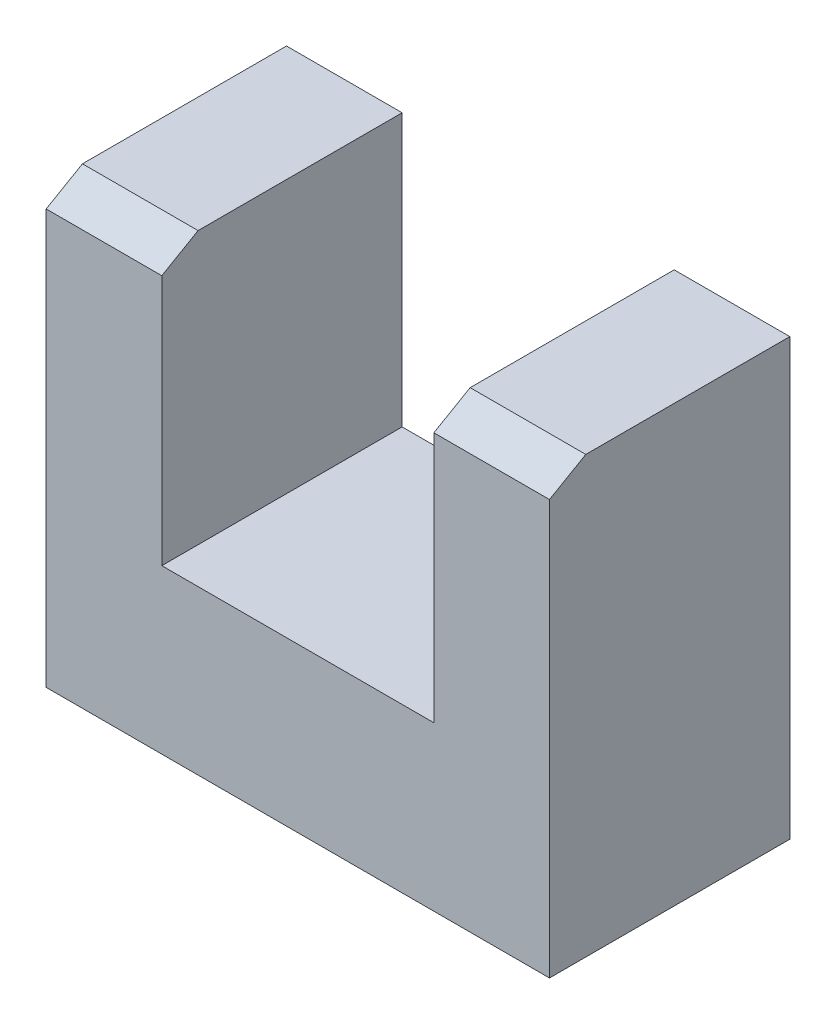
ISO-10303-21;
HEADER;
FILE_DESCRIPTION(('STEP AP214'),'2;1');
FILE_NAME('part.step','',(''),(''),'','','');
FILE_SCHEMA(('AUTOMOTIVE_DESIGN { 1 0 10303 214 1 1 1 1 }'));
ENDSEC;
DATA;
#1=APPLICATION_CONTEXT('core data for automotive mechanical design processes');
#2=APPLICATION_PROTOCOL_DEFINITION('international standard','automotive_design',2000,#1);
#3=PRODUCT_CONTEXT('',#1,'mechanical');
#4=PRODUCT('Part','Part','',(#3));
#5=PRODUCT_RELATED_PRODUCT_CATEGORY('part','',(#4));
#6=PRODUCT_DEFINITION_FORMATION('','',#4);
#7=PRODUCT_DEFINITION_CONTEXT('part definition',#1,'design');
#8=PRODUCT_DEFINITION('design','',#6,#7);
#9=PRODUCT_DEFINITION_SHAPE('','',#8);
#10=(LENGTH_UNIT() NAMED_UNIT(*) SI_UNIT(.MILLI.,.METRE.));
#11=(NAMED_UNIT(*) PLANE_ANGLE_UNIT() SI_UNIT($,.RADIAN.));
#12=(NAMED_UNIT(*) SI_UNIT($,.STERADIAN.) SOLID_ANGLE_UNIT());
#13=UNCERTAINTY_MEASURE_WITH_UNIT(LENGTH_MEASURE(1.E-05),#10,'distance_accuracy_value','');
#14=(GEOMETRIC_REPRESENTATION_CONTEXT(3) GLOBAL_UNCERTAINTY_ASSIGNED_CONTEXT((#13)) GLOBAL_UNIT_ASSIGNED_CONTEXT((#10,
#11,#12)) REPRESENTATION_CONTEXT('',''));
#15=CARTESIAN_POINT('',(0.,0.,0.));
#16=DIRECTION('',(0.,0.,1.));
#17=DIRECTION('',(1.,0.,0.));
#18=AXIS2_PLACEMENT_3D('',#15,#16,#17);
#19=CARTESIAN_POINT('',(1.5,0.,2.65));
#20=DIRECTION('',(1.,0.,0.));
#21=DIRECTION('',(0.,1.,0.));
#22=AXIS2_PLACEMENT_3D('',#19,#20,#21);
#23=PLANE('',#22);
#24=DIRECTION('',(0.,-1.,0.));
#25=VECTOR('',#24,1.);
#26=CARTESIAN_POINT('',(1.5,0.,2.65));
#27=LINE('',#26,#25);
#28=CARTESIAN_POINT('',(1.5,2.76905989232415,2.65));
#29=VERTEX_POINT('',#28);
#30=CARTESIAN_POINT('',(1.5,0.,2.65));
#31=VERTEX_POINT('',#30);
#32=EDGE_CURVE('E108',#29,#31,#27,.T.);
#33=ORIENTED_EDGE('',*,*,#32,.F.);
#34=DIRECTION('',(0.,-0.499999999999999,0.866025403784439));
#35=VECTOR('',#34,1.);
#36=CARTESIAN_POINT('',(1.5,2.76905989232415,2.65));
#37=LINE('',#36,#35);
#38=CARTESIAN_POINT('',(1.5,3.,2.25));
#39=VERTEX_POINT('',#38);
#40=EDGE_CURVE('E142',#29,#39,#37,.F.);
#41=ORIENTED_EDGE('',*,*,#40,.T.);
#42=DIRECTION('',(0.,0.,-1.));
#43=VECTOR('',#42,1.);
#44=CARTESIAN_POINT('',(1.5,3.,2.65));
#45=LINE('',#44,#43);
#46=CARTESIAN_POINT('',(1.5,3.,0.));
#47=VERTEX_POINT('',#46);
#48=EDGE_CURVE('E162',#39,#47,#45,.T.);
#49=ORIENTED_EDGE('',*,*,#48,.T.);
#50=DIRECTION('',(0.,-1.,0.));
#51=VECTOR('',#50,1.);
#52=CARTESIAN_POINT('',(1.5,0.,0.));
#53=LINE('',#52,#51);
#54=CARTESIAN_POINT('',(1.5,0.,0.));
#55=VERTEX_POINT('',#54);
#56=EDGE_CURVE('E132',#47,#55,#53,.T.);
#57=ORIENTED_EDGE('',*,*,#56,.T.);
#58=DIRECTION('',(0.,0.,-1.));
#59=VECTOR('',#58,1.);
#60=CARTESIAN_POINT('',(1.5,0.,2.65));
#61=LINE('',#60,#59);
#62=EDGE_CURVE('E124',#31,#55,#61,.T.);
#63=ORIENTED_EDGE('',*,*,#62,.F.);
#64=EDGE_LOOP('',(#33,#41,#49,#57,#63));
#65=FACE_BOUND('',#64,.T.);
#66=ADVANCED_FACE('F33',(#65),#23,.F.);
#67=CARTESIAN_POINT('',(-1.5,0.,2.65));
#68=DIRECTION('',(0.,-1.,0.));
#69=DIRECTION('',(1.,0.,0.));
#70=AXIS2_PLACEMENT_3D('',#67,#68,#69);
#71=PLANE('',#70);
#72=DIRECTION('',(-1.,0.,0.));
#73=VECTOR('',#72,1.);
#74=CARTESIAN_POINT('',(-1.5,0.,0.));
#75=LINE('',#74,#73);
#76=CARTESIAN_POINT('',(-1.5,0.,0.));
#77=VERTEX_POINT('',#76);
#78=EDGE_CURVE('E193',#55,#77,#75,.T.);
#79=ORIENTED_EDGE('',*,*,#78,.T.);
#80=DIRECTION('',(0.,0.,-1.));
#81=VECTOR('',#80,1.);
#82=CARTESIAN_POINT('',(-1.5,0.,2.65));
#83=LINE('',#82,#81);
#84=CARTESIAN_POINT('',(-1.5,0.,2.65));
#85=VERTEX_POINT('',#84);
#86=EDGE_CURVE('E127',#85,#77,#83,.T.);
#87=ORIENTED_EDGE('',*,*,#86,.F.);
#88=DIRECTION('',(-1.,0.,0.));
#89=VECTOR('',#88,1.);
#90=CARTESIAN_POINT('',(-1.5,0.,2.65));
#91=LINE('',#90,#89);
#92=EDGE_CURVE('E113',#31,#85,#91,.T.);
#93=ORIENTED_EDGE('',*,*,#92,.F.);
#94=ORIENTED_EDGE('',*,*,#62,.T.);
#95=EDGE_LOOP('',(#79,#87,#93,#94));
#96=FACE_BOUND('',#95,.T.);
#97=ADVANCED_FACE('F123',(#96),#71,.F.);
#98=CARTESIAN_POINT('',(-1.5,0.,2.65));
#99=DIRECTION('',(-1.,0.,0.));
#100=DIRECTION('',(0.,-1.,0.));
#101=AXIS2_PLACEMENT_3D('',#98,#99,#100);
#102=PLANE('',#101);
#103=DIRECTION('',(0.,0.,-1.));
#104=VECTOR('',#103,1.);
#105=CARTESIAN_POINT('',(-1.5,3.,2.65));
#106=LINE('',#105,#104);
#107=CARTESIAN_POINT('',(-1.5,3.,2.25));
#108=VERTEX_POINT('',#107);
#109=CARTESIAN_POINT('',(-1.5,3.,0.));
#110=VERTEX_POINT('',#109);
#111=EDGE_CURVE('E137',#108,#110,#106,.T.);
#112=ORIENTED_EDGE('',*,*,#111,.F.);
#113=DIRECTION('',(0.,0.5,-0.866025403784439));
#114=VECTOR('',#113,1.);
#115=CARTESIAN_POINT('',(-1.5,2.76905989232415,2.65));
#116=LINE('',#115,#114);
#117=CARTESIAN_POINT('',(-1.5,2.76905989232415,2.65));
#118=VERTEX_POINT('',#117);
#119=EDGE_CURVE('E11',#108,#118,#116,.F.);
#120=ORIENTED_EDGE('',*,*,#119,.T.);
#121=DIRECTION('',(0.,1.,0.));
#122=VECTOR('',#121,1.);
#123=CARTESIAN_POINT('',(-1.5,0.,2.65));
#124=LINE('',#123,#122);
#125=EDGE_CURVE('E129',#85,#118,#124,.T.);
#126=ORIENTED_EDGE('',*,*,#125,.F.);
#127=ORIENTED_EDGE('',*,*,#86,.T.);
#128=DIRECTION('',(0.,1.,0.));
#129=VECTOR('',#128,1.);
#130=CARTESIAN_POINT('',(-1.5,0.,0.));
#131=LINE('',#130,#129);
#132=EDGE_CURVE('E190',#77,#110,#131,.T.);
#133=ORIENTED_EDGE('',*,*,#132,.T.);
#134=EDGE_LOOP('',(#112,#120,#126,#127,#133));
#135=FACE_BOUND('',#134,.T.);
#136=ADVANCED_FACE('F191',(#135),#102,.F.);
#137=CARTESIAN_POINT('',(-1.5,3.,2.65));
#138=DIRECTION('',(0.,-1.,0.));
#139=DIRECTION('',(1.,0.,0.));
#140=AXIS2_PLACEMENT_3D('',#137,#138,#139);
#141=PLANE('',#140);
#142=DIRECTION('',(0.,0.,-1.));
#143=VECTOR('',#142,1.);
#144=CARTESIAN_POINT('',(-2.775,3.,2.65));
#145=LINE('',#144,#143);
#146=CARTESIAN_POINT('',(-2.775,3.,2.25));
#147=VERTEX_POINT('',#146);
#148=CARTESIAN_POINT('',(-2.775,3.,0.));
#149=VERTEX_POINT('',#148);
#150=EDGE_CURVE('E180',#147,#149,#145,.T.);
#151=ORIENTED_EDGE('',*,*,#150,.F.);
#152=DIRECTION('',(1.,0.,0.));
#153=VECTOR('',#152,1.);
#154=CARTESIAN_POINT('',(-1.5,3.,2.25));
#155=LINE('',#154,#153);
#156=EDGE_CURVE('E41',#147,#108,#155,.T.);
#157=ORIENTED_EDGE('',*,*,#156,.T.);
#158=ORIENTED_EDGE('',*,*,#111,.T.);
#159=DIRECTION('',(-1.,0.,0.));
#160=VECTOR('',#159,1.);
#161=CARTESIAN_POINT('',(-1.5,3.,0.));
#162=LINE('',#161,#160);
#163=EDGE_CURVE('E185',#110,#149,#162,.T.);
#164=ORIENTED_EDGE('',*,*,#163,.T.);
#165=EDGE_LOOP('',(#151,#157,#158,#164));
#166=FACE_BOUND('',#165,.T.);
#167=ADVANCED_FACE('F183',(#166),#141,.F.);
#168=CARTESIAN_POINT('',(-2.775,3.,2.65));
#169=DIRECTION('',(1.,0.,0.));
#170=DIRECTION('',(0.,1.,0.));
#171=AXIS2_PLACEMENT_3D('',#168,#169,#170);
#172=PLANE('',#171);
#173=DIRECTION('',(0.,-1.,0.));
#174=VECTOR('',#173,1.);
#175=CARTESIAN_POINT('',(-2.775,3.,2.65));
#176=LINE('',#175,#174);
#177=CARTESIAN_POINT('',(-2.775,2.76905989232415,2.65));
#178=VERTEX_POINT('',#177);
#179=CARTESIAN_POINT('',(-2.775,-1.8,2.65));
#180=VERTEX_POINT('',#179);
#181=EDGE_CURVE('E208',#178,#180,#176,.T.);
#182=ORIENTED_EDGE('',*,*,#181,.F.);
#183=DIRECTION('',(0.,-0.5,0.866025403784439));
#184=VECTOR('',#183,1.);
#185=CARTESIAN_POINT('',(-2.775,2.76905989232415,2.65));
#186=LINE('',#185,#184);
#187=EDGE_CURVE('E55',#178,#147,#186,.F.);
#188=ORIENTED_EDGE('',*,*,#187,.T.);
#189=ORIENTED_EDGE('',*,*,#150,.T.);
#190=DIRECTION('',(0.,-1.,0.));
#191=VECTOR('',#190,1.);
#192=CARTESIAN_POINT('',(-2.775,3.,0.));
#193=LINE('',#192,#191);
#194=CARTESIAN_POINT('',(-2.775,-1.8,0.));
#195=VERTEX_POINT('',#194);
#196=EDGE_CURVE('E197',#149,#195,#193,.T.);
#197=ORIENTED_EDGE('',*,*,#196,.T.);
#198=DIRECTION('',(0.,0.,-1.));
#199=VECTOR('',#198,1.);
#200=CARTESIAN_POINT('',(-2.775,-1.8,2.65));
#201=LINE('',#200,#199);
#202=EDGE_CURVE('E177',#180,#195,#201,.T.);
#203=ORIENTED_EDGE('',*,*,#202,.F.);
#204=EDGE_LOOP('',(#182,#188,#189,#197,#203));
#205=FACE_BOUND('',#204,.T.);
#206=ADVANCED_FACE('F227',(#205),#172,.F.);
#207=CARTESIAN_POINT('',(2.775,-1.8,2.65));
#208=DIRECTION('',(0.,1.,0.));
#209=DIRECTION('',(-1.,0.,0.));
#210=AXIS2_PLACEMENT_3D('',#207,#208,#209);
#211=PLANE('',#210);
#212=DIRECTION('',(1.,0.,0.));
#213=VECTOR('',#212,1.);
#214=CARTESIAN_POINT('',(2.775,-1.8,0.));
#215=LINE('',#214,#213);
#216=CARTESIAN_POINT('',(2.775,-1.8,0.));
#217=VERTEX_POINT('',#216);
#218=EDGE_CURVE('E199',#195,#217,#215,.T.);
#219=ORIENTED_EDGE('',*,*,#218,.T.);
#220=DIRECTION('',(0.,0.,-1.));
#221=VECTOR('',#220,1.);
#222=CARTESIAN_POINT('',(2.775,-1.8,2.65));
#223=LINE('',#222,#221);
#224=CARTESIAN_POINT('',(2.775,-1.8,2.65));
#225=VERTEX_POINT('',#224);
#226=EDGE_CURVE('E171',#225,#217,#223,.T.);
#227=ORIENTED_EDGE('',*,*,#226,.F.);
#228=DIRECTION('',(1.,0.,0.));
#229=VECTOR('',#228,1.);
#230=CARTESIAN_POINT('',(2.775,-1.8,2.65));
#231=LINE('',#230,#229);
#232=EDGE_CURVE('E160',#180,#225,#231,.T.);
#233=ORIENTED_EDGE('',*,*,#232,.F.);
#234=ORIENTED_EDGE('',*,*,#202,.T.);
#235=EDGE_LOOP('',(#219,#227,#233,#234));
#236=FACE_BOUND('',#235,.T.);
#237=ADVANCED_FACE('F230',(#236),#211,.F.);
#238=CARTESIAN_POINT('',(2.775,3.,2.65));
#239=DIRECTION('',(-1.,0.,0.));
#240=DIRECTION('',(0.,0.,1.));
#241=AXIS2_PLACEMENT_3D('',#238,#239,#240);
#242=PLANE('',#241);
#243=DIRECTION('',(0.,0.,-1.));
#244=VECTOR('',#243,1.);
#245=CARTESIAN_POINT('',(2.775,3.,2.65));
#246=LINE('',#245,#244);
#247=CARTESIAN_POINT('',(2.775,3.,2.25));
#248=VERTEX_POINT('',#247);
#249=CARTESIAN_POINT('',(2.775,3.,0.));
#250=VERTEX_POINT('',#249);
#251=EDGE_CURVE('E156',#248,#250,#246,.T.);
#252=ORIENTED_EDGE('',*,*,#251,.F.);
#253=DIRECTION('',(0.,0.499999999999999,-0.866025403784439));
#254=VECTOR('',#253,1.);
#255=CARTESIAN_POINT('',(2.775,2.76905989232415,2.65));
#256=LINE('',#255,#254);
#257=CARTESIAN_POINT('',(2.775,2.76905989232415,2.65));
#258=VERTEX_POINT('',#257);
#259=EDGE_CURVE('E146',#248,#258,#256,.F.);
#260=ORIENTED_EDGE('',*,*,#259,.T.);
#261=DIRECTION('',(0.,1.,0.));
#262=VECTOR('',#261,1.);
#263=CARTESIAN_POINT('',(2.775,3.,2.65));
#264=LINE('',#263,#262);
#265=EDGE_CURVE('E154',#225,#258,#264,.T.);
#266=ORIENTED_EDGE('',*,*,#265,.F.);
#267=ORIENTED_EDGE('',*,*,#226,.T.);
#268=DIRECTION('',(0.,1.,0.));
#269=VECTOR('',#268,1.);
#270=CARTESIAN_POINT('',(2.775,3.,0.));
#271=LINE('',#270,#269);
#272=EDGE_CURVE('E203',#217,#250,#271,.T.);
#273=ORIENTED_EDGE('',*,*,#272,.T.);
#274=EDGE_LOOP('',(#252,#260,#266,#267,#273));
#275=FACE_BOUND('',#274,.T.);
#276=ADVANCED_FACE('F152',(#275),#242,.F.);
#277=CARTESIAN_POINT('',(1.5,3.,2.65));
#278=DIRECTION('',(0.,-1.,0.));
#279=DIRECTION('',(0.,0.,-1.));
#280=AXIS2_PLACEMENT_3D('',#277,#278,#279);
#281=PLANE('',#280);
#282=ORIENTED_EDGE('',*,*,#48,.F.);
#283=DIRECTION('',(1.,0.,0.));
#284=VECTOR('',#283,1.);
#285=CARTESIAN_POINT('',(1.5,3.,2.25));
#286=LINE('',#285,#284);
#287=EDGE_CURVE('E144',#39,#248,#286,.T.);
#288=ORIENTED_EDGE('',*,*,#287,.T.);
#289=ORIENTED_EDGE('',*,*,#251,.T.);
#290=DIRECTION('',(-1.,0.,0.));
#291=VECTOR('',#290,1.);
#292=CARTESIAN_POINT('',(1.5,3.,0.));
#293=LINE('',#292,#291);
#294=EDGE_CURVE('E119',#250,#47,#293,.T.);
#295=ORIENTED_EDGE('',*,*,#294,.T.);
#296=EDGE_LOOP('',(#282,#288,#289,#295));
#297=FACE_BOUND('',#296,.T.);
#298=ADVANCED_FACE('F168',(#297),#281,.F.);
#299=CARTESIAN_POINT('',(0.,0.,2.65));
#300=DIRECTION('',(0.,0.,-1.));
#301=DIRECTION('',(-1.,0.,0.));
#302=AXIS2_PLACEMENT_3D('',#299,#300,#301);
#303=PLANE('',#302);
#304=ORIENTED_EDGE('',*,*,#265,.T.);
#305=DIRECTION('',(-1.,0.,0.));
#306=VECTOR('',#305,1.);
#307=CARTESIAN_POINT('',(0.,2.76905989232415,2.65));
#308=LINE('',#307,#306);
#309=EDGE_CURVE('E116',#258,#29,#308,.T.);
#310=ORIENTED_EDGE('',*,*,#309,.T.);
#311=ORIENTED_EDGE('',*,*,#32,.T.);
#312=ORIENTED_EDGE('',*,*,#92,.T.);
#313=ORIENTED_EDGE('',*,*,#125,.T.);
#314=DIRECTION('',(-1.,0.,0.));
#315=VECTOR('',#314,1.);
#316=CARTESIAN_POINT('',(0.,2.76905989232415,2.65));
#317=LINE('',#316,#315);
#318=EDGE_CURVE('E133',#118,#178,#317,.T.);
#319=ORIENTED_EDGE('',*,*,#318,.T.);
#320=ORIENTED_EDGE('',*,*,#181,.T.);
#321=ORIENTED_EDGE('',*,*,#232,.T.);
#322=EDGE_LOOP('',(#304,#310,#311,#312,#313,#319,#320,#321));
#323=FACE_BOUND('',#322,.T.);
#324=ADVANCED_FACE('F111',(#323),#303,.F.);
#325=CARTESIAN_POINT('',(0.,0.,0.));
#326=DIRECTION('',(0.,0.,-1.));
#327=DIRECTION('',(-1.,0.,0.));
#328=AXIS2_PLACEMENT_3D('',#325,#326,#327);
#329=PLANE('',#328);
#330=ORIENTED_EDGE('',*,*,#56,.F.);
#331=ORIENTED_EDGE('',*,*,#294,.F.);
#332=ORIENTED_EDGE('',*,*,#272,.F.);
#333=ORIENTED_EDGE('',*,*,#218,.F.);
#334=ORIENTED_EDGE('',*,*,#196,.F.);
#335=ORIENTED_EDGE('',*,*,#163,.F.);
#336=ORIENTED_EDGE('',*,*,#132,.F.);
#337=ORIENTED_EDGE('',*,*,#78,.F.);
#338=EDGE_LOOP('',(#330,#331,#332,#333,#334,#335,#336,#337));
#339=FACE_BOUND('',#338,.T.);
#340=ADVANCED_FACE('F195',(#339),#329,.T.);
#341=CARTESIAN_POINT('',(0.,2.76905989232415,2.65));
#342=DIRECTION('',(0.,-0.866025403784439,-0.499999999999999));
#343=DIRECTION('',(-1.,0.,0.));
#344=AXIS2_PLACEMENT_3D('',#341,#342,#343);
#345=PLANE('',#344);
#346=ORIENTED_EDGE('',*,*,#259,.F.);
#347=ORIENTED_EDGE('',*,*,#287,.F.);
#348=ORIENTED_EDGE('',*,*,#40,.F.);
#349=ORIENTED_EDGE('',*,*,#309,.F.);
#350=EDGE_LOOP('',(#346,#347,#348,#349));
#351=FACE_BOUND('',#350,.T.);
#352=ADVANCED_FACE('F164',(#351),#345,.F.);
#353=CARTESIAN_POINT('',(0.,2.76905989232415,2.65));
#354=DIRECTION('',(0.,-0.866025403784439,-0.5));
#355=DIRECTION('',(-1.,0.,0.));
#356=AXIS2_PLACEMENT_3D('',#353,#354,#355);
#357=PLANE('',#356);
#358=ORIENTED_EDGE('',*,*,#119,.F.);
#359=ORIENTED_EDGE('',*,*,#156,.F.);
#360=ORIENTED_EDGE('',*,*,#187,.F.);
#361=ORIENTED_EDGE('',*,*,#318,.F.);
#362=EDGE_LOOP('',(#358,#359,#360,#361));
#363=FACE_BOUND('',#362,.T.);
#364=ADVANCED_FACE('F35',(#363),#357,.F.);
#365=CLOSED_SHELL('',(#66,#97,#136,#167,#206,#237,#276,#298,#324,#340,#352,#364));
#366=MANIFOLD_SOLID_BREP('B2',#365);
#367=ADVANCED_BREP_SHAPE_REPRESENTATION('',(#18,#366),#14);
#368=SHAPE_DEFINITION_REPRESENTATION(#9,#367);
ENDSEC;
END-ISO-10303-21;
